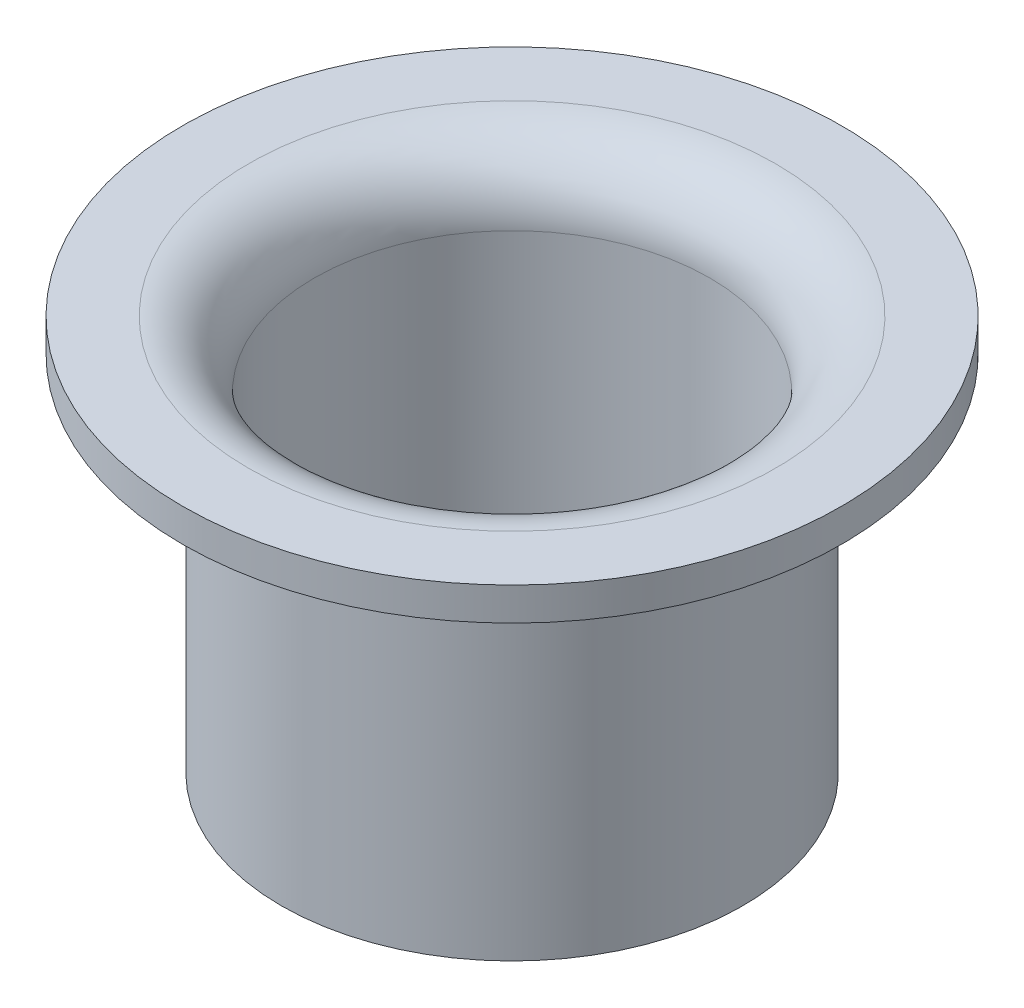
ISO-10303-21;
HEADER;
FILE_DESCRIPTION(('STEP AP214'),'2;1');
FILE_NAME('part.step','',(''),(''),'','','');
FILE_SCHEMA(('AUTOMOTIVE_DESIGN { 1 0 10303 214 1 1 1 1 }'));
ENDSEC;
DATA;
#1=APPLICATION_CONTEXT('core data for automotive mechanical design processes');
#2=APPLICATION_PROTOCOL_DEFINITION('international standard','automotive_design',2000,#1);
#3=PRODUCT_CONTEXT('',#1,'mechanical');
#4=PRODUCT('Part','Part','',(#3));
#5=PRODUCT_RELATED_PRODUCT_CATEGORY('part','',(#4));
#6=PRODUCT_DEFINITION_FORMATION('','',#4);
#7=PRODUCT_DEFINITION_CONTEXT('part definition',#1,'design');
#8=PRODUCT_DEFINITION('design','',#6,#7);
#9=PRODUCT_DEFINITION_SHAPE('','',#8);
#10=(LENGTH_UNIT() NAMED_UNIT(*) SI_UNIT(.MILLI.,.METRE.));
#11=(NAMED_UNIT(*) PLANE_ANGLE_UNIT() SI_UNIT($,.RADIAN.));
#12=(NAMED_UNIT(*) SI_UNIT($,.STERADIAN.) SOLID_ANGLE_UNIT());
#13=UNCERTAINTY_MEASURE_WITH_UNIT(LENGTH_MEASURE(1.E-05),#10,'distance_accuracy_value','');
#14=(GEOMETRIC_REPRESENTATION_CONTEXT(3) GLOBAL_UNCERTAINTY_ASSIGNED_CONTEXT((#13)) GLOBAL_UNIT_ASSIGNED_CONTEXT((#10,
#11,#12)) REPRESENTATION_CONTEXT('',''));
#15=CARTESIAN_POINT('',(0.,0.,0.));
#16=DIRECTION('',(0.,0.,1.));
#17=DIRECTION('',(1.,0.,0.));
#18=AXIS2_PLACEMENT_3D('',#15,#16,#17);
#19=CARTESIAN_POINT('',(0.,-1.,0.));
#20=DIRECTION('',(0.,1.,0.));
#21=DIRECTION('',(0.,0.,1.));
#22=AXIS2_PLACEMENT_3D('',#19,#20,#21);
#23=TOROIDAL_SURFACE('',#22,8.,1.);
#24=CARTESIAN_POINT('',(0.,-1.00000000000001,0.));
#25=DIRECTION('',(0.,1.,0.));
#26=DIRECTION('',(0.,0.,1.));
#27=AXIS2_PLACEMENT_3D('',#24,#25,#26);
#28=CIRCLE('',#27,7.);
#29=CARTESIAN_POINT('',(0.,-1.00000000000001,7.));
#30=VERTEX_POINT('',#29);
#31=EDGE_CURVE('E62',#30,#30,#28,.T.);
#32=ORIENTED_EDGE('',*,*,#31,.T.);
#33=EDGE_LOOP('',(#32));
#34=FACE_BOUND('',#33,.T.);
#35=CARTESIAN_POINT('',(0.,0.,0.));
#36=DIRECTION('',(0.,1.,0.));
#37=DIRECTION('',(0.,0.,1.));
#38=AXIS2_PLACEMENT_3D('',#35,#36,#37);
#39=CIRCLE('',#38,8.);
#40=CARTESIAN_POINT('',(0.,0.,8.));
#41=VERTEX_POINT('',#40);
#42=EDGE_CURVE('E10',#41,#41,#39,.T.);
#43=ORIENTED_EDGE('',*,*,#42,.F.);
#44=EDGE_LOOP('',(#43));
#45=FACE_BOUND('',#44,.T.);
#46=ADVANCED_FACE('F34',(#34,#45),#23,.F.);
#47=CARTESIAN_POINT('',(-8.,0.,0.));
#48=DIRECTION('',(0.,-1.,0.));
#49=DIRECTION('',(0.,0.,-1.));
#50=AXIS2_PLACEMENT_3D('',#47,#48,#49);
#51=PLANE('',#50);
#52=ORIENTED_EDGE('',*,*,#42,.T.);
#53=EDGE_LOOP('',(#52));
#54=FACE_BOUND('',#53,.T.);
#55=CARTESIAN_POINT('',(0.,0.,0.));
#56=DIRECTION('',(0.,1.,0.));
#57=DIRECTION('',(0.,0.,1.));
#58=AXIS2_PLACEMENT_3D('',#55,#56,#57);
#59=CIRCLE('',#58,10.);
#60=CARTESIAN_POINT('',(0.,0.,10.));
#61=VERTEX_POINT('',#60);
#62=EDGE_CURVE('E40',#61,#61,#59,.T.);
#63=ORIENTED_EDGE('',*,*,#62,.F.);
#64=EDGE_LOOP('',(#63));
#65=FACE_BOUND('',#64,.T.);
#66=ADVANCED_FACE('F80',(#54,#65),#51,.T.);
#67=CARTESIAN_POINT('',(0.,7.79097146104819,0.));
#68=DIRECTION('',(0.,1.,0.));
#69=DIRECTION('',(0.,0.,1.));
#70=AXIS2_PLACEMENT_3D('',#67,#68,#69);
#71=CYLINDRICAL_SURFACE('',#70,10.);
#72=ORIENTED_EDGE('',*,*,#62,.T.);
#73=EDGE_LOOP('',(#72));
#74=FACE_BOUND('',#73,.T.);
#75=CARTESIAN_POINT('',(0.,0.999999999999997,0.));
#76=DIRECTION('',(0.,1.,0.));
#77=DIRECTION('',(0.,0.,1.));
#78=AXIS2_PLACEMENT_3D('',#75,#76,#77);
#79=CIRCLE('',#78,10.);
#80=CARTESIAN_POINT('',(0.,0.999999999999997,10.));
#81=VERTEX_POINT('',#80);
#82=EDGE_CURVE('E44',#81,#81,#79,.T.);
#83=ORIENTED_EDGE('',*,*,#82,.F.);
#84=EDGE_LOOP('',(#83));
#85=FACE_BOUND('',#84,.T.);
#86=ADVANCED_FACE('F84',(#74,#85),#71,.T.);
#87=CARTESIAN_POINT('',(-10.,0.999999999999999,0.));
#88=DIRECTION('',(0.,1.,0.));
#89=DIRECTION('',(0.,0.,1.));
#90=AXIS2_PLACEMENT_3D('',#87,#88,#89);
#91=PLANE('',#90);
#92=ORIENTED_EDGE('',*,*,#82,.T.);
#93=EDGE_LOOP('',(#92));
#94=FACE_BOUND('',#93,.T.);
#95=CARTESIAN_POINT('',(0.,1.,0.));
#96=DIRECTION('',(0.,1.,0.));
#97=DIRECTION('',(0.,0.,1.));
#98=AXIS2_PLACEMENT_3D('',#95,#96,#97);
#99=CIRCLE('',#98,8.);
#100=CARTESIAN_POINT('',(0.,1.,8.));
#101=VERTEX_POINT('',#100);
#102=EDGE_CURVE('E48',#101,#101,#99,.T.);
#103=ORIENTED_EDGE('',*,*,#102,.F.);
#104=EDGE_LOOP('',(#103));
#105=FACE_BOUND('',#104,.T.);
#106=ADVANCED_FACE('F88',(#94,#105),#91,.T.);
#107=CARTESIAN_POINT('',(0.,-1.,0.));
#108=DIRECTION('',(0.,1.,0.));
#109=DIRECTION('',(0.,0.,1.));
#110=AXIS2_PLACEMENT_3D('',#107,#108,#109);
#111=TOROIDAL_SURFACE('',#110,8.,2.);
#112=ORIENTED_EDGE('',*,*,#102,.T.);
#113=EDGE_LOOP('',(#112));
#114=FACE_BOUND('',#113,.T.);
#115=CARTESIAN_POINT('',(0.,-1.,0.));
#116=DIRECTION('',(0.,1.,0.));
#117=DIRECTION('',(0.,0.,1.));
#118=AXIS2_PLACEMENT_3D('',#115,#116,#117);
#119=CIRCLE('',#118,6.);
#120=CARTESIAN_POINT('',(0.,-1.,6.));
#121=VERTEX_POINT('',#120);
#122=EDGE_CURVE('E53',#121,#121,#119,.T.);
#123=ORIENTED_EDGE('',*,*,#122,.F.);
#124=EDGE_LOOP('',(#123));
#125=FACE_BOUND('',#124,.T.);
#126=ADVANCED_FACE('F94',(#114,#125),#111,.T.);
#127=CARTESIAN_POINT('',(0.,7.79097146104819,0.));
#128=DIRECTION('',(0.,1.,0.));
#129=DIRECTION('',(0.,0.,1.));
#130=AXIS2_PLACEMENT_3D('',#127,#128,#129);
#131=CYLINDRICAL_SURFACE('',#130,6.);
#132=ORIENTED_EDGE('',*,*,#122,.T.);
#133=EDGE_LOOP('',(#132));
#134=FACE_BOUND('',#133,.T.);
#135=CARTESIAN_POINT('',(0.,-11.,0.));
#136=DIRECTION('',(0.,1.,0.));
#137=DIRECTION('',(0.,0.,1.));
#138=AXIS2_PLACEMENT_3D('',#135,#136,#137);
#139=CIRCLE('',#138,6.);
#140=CARTESIAN_POINT('',(0.,-11.,6.));
#141=VERTEX_POINT('',#140);
#142=EDGE_CURVE('E56',#141,#141,#139,.T.);
#143=ORIENTED_EDGE('',*,*,#142,.F.);
#144=EDGE_LOOP('',(#143));
#145=FACE_BOUND('',#144,.T.);
#146=ADVANCED_FACE('F76',(#134,#145),#131,.F.);
#147=CARTESIAN_POINT('',(-6.,-11.,0.));
#148=DIRECTION('',(0.,-1.,0.));
#149=DIRECTION('',(0.,0.,-1.));
#150=AXIS2_PLACEMENT_3D('',#147,#148,#149);
#151=PLANE('',#150);
#152=ORIENTED_EDGE('',*,*,#142,.T.);
#153=EDGE_LOOP('',(#152));
#154=FACE_BOUND('',#153,.T.);
#155=CARTESIAN_POINT('',(0.,-11.,0.));
#156=DIRECTION('',(0.,1.,0.));
#157=DIRECTION('',(0.,0.,1.));
#158=AXIS2_PLACEMENT_3D('',#155,#156,#157);
#159=CIRCLE('',#158,7.);
#160=CARTESIAN_POINT('',(0.,-11.,7.));
#161=VERTEX_POINT('',#160);
#162=EDGE_CURVE('E59',#161,#161,#159,.T.);
#163=ORIENTED_EDGE('',*,*,#162,.F.);
#164=EDGE_LOOP('',(#163));
#165=FACE_BOUND('',#164,.T.);
#166=ADVANCED_FACE('F70',(#154,#165),#151,.T.);
#167=CARTESIAN_POINT('',(0.,7.79097146104819,0.));
#168=DIRECTION('',(0.,1.,0.));
#169=DIRECTION('',(0.,0.,1.));
#170=AXIS2_PLACEMENT_3D('',#167,#168,#169);
#171=CYLINDRICAL_SURFACE('',#170,7.);
#172=ORIENTED_EDGE('',*,*,#162,.T.);
#173=EDGE_LOOP('',(#172));
#174=FACE_BOUND('',#173,.T.);
#175=ORIENTED_EDGE('',*,*,#31,.F.);
#176=EDGE_LOOP('',(#175));
#177=FACE_BOUND('',#176,.T.);
#178=ADVANCED_FACE('F68',(#174,#177),#171,.T.);
#179=CLOSED_SHELL('',(#46,#66,#86,#106,#126,#146,#166,#178));
#180=MANIFOLD_SOLID_BREP('B2',#179);
#181=ADVANCED_BREP_SHAPE_REPRESENTATION('',(#18,#180),#14);
#182=SHAPE_DEFINITION_REPRESENTATION(#9,#181);
ENDSEC;
END-ISO-10303-21;
